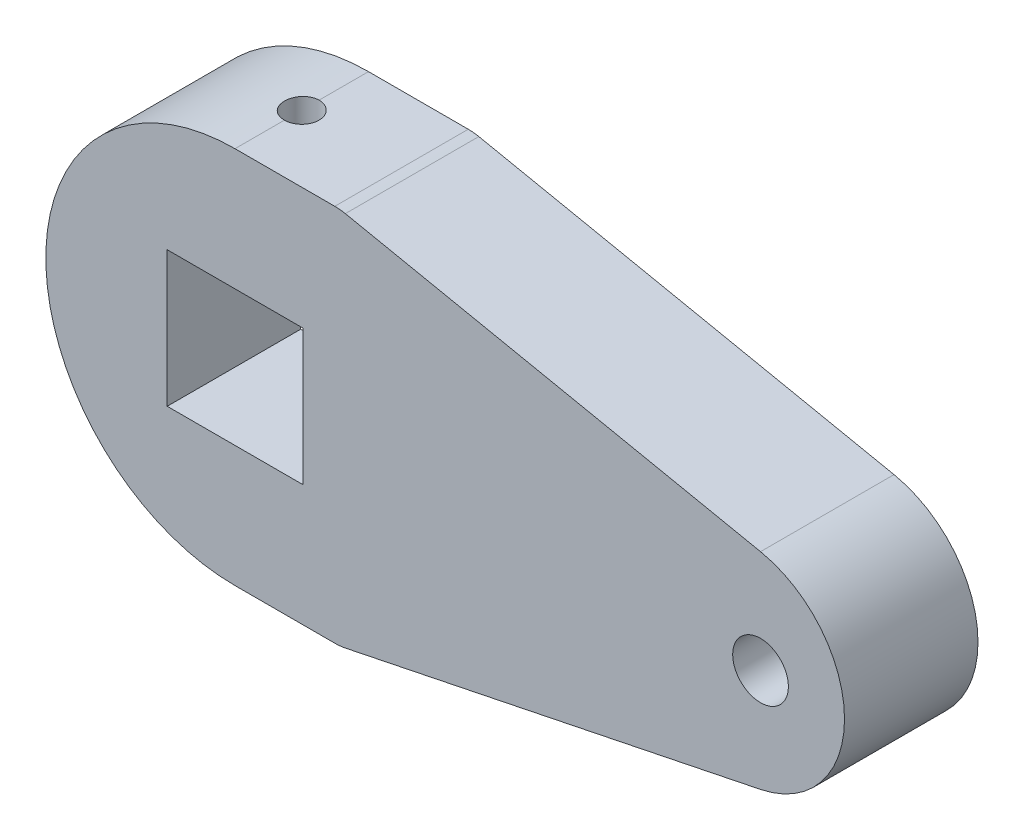
ISO-10303-21;
HEADER;
FILE_DESCRIPTION(('STEP AP214'),'2;1');
FILE_NAME('part.step','',(''),(''),'','','');
FILE_SCHEMA(('AUTOMOTIVE_DESIGN { 1 0 10303 214 1 1 1 1 }'));
ENDSEC;
DATA;
#1=APPLICATION_CONTEXT('core data for automotive mechanical design processes');
#2=APPLICATION_PROTOCOL_DEFINITION('international standard','automotive_design',2000,#1);
#3=PRODUCT_CONTEXT('',#1,'mechanical');
#4=PRODUCT('Part','Part','',(#3));
#5=PRODUCT_RELATED_PRODUCT_CATEGORY('part','',(#4));
#6=PRODUCT_DEFINITION_FORMATION('','',#4);
#7=PRODUCT_DEFINITION_CONTEXT('part definition',#1,'design');
#8=PRODUCT_DEFINITION('design','',#6,#7);
#9=PRODUCT_DEFINITION_SHAPE('','',#8);
#10=(LENGTH_UNIT() NAMED_UNIT(*) SI_UNIT(.MILLI.,.METRE.));
#11=(NAMED_UNIT(*) PLANE_ANGLE_UNIT() SI_UNIT($,.RADIAN.));
#12=(NAMED_UNIT(*) SI_UNIT($,.STERADIAN.) SOLID_ANGLE_UNIT());
#13=UNCERTAINTY_MEASURE_WITH_UNIT(LENGTH_MEASURE(1.E-05),#10,'distance_accuracy_value','');
#14=(GEOMETRIC_REPRESENTATION_CONTEXT(3) GLOBAL_UNCERTAINTY_ASSIGNED_CONTEXT((#13)) GLOBAL_UNIT_ASSIGNED_CONTEXT((#10,
#11,#12)) REPRESENTATION_CONTEXT('',''));
#15=CARTESIAN_POINT('',(0.,0.,0.));
#16=DIRECTION('',(0.,0.,1.));
#17=DIRECTION('',(1.,0.,0.));
#18=AXIS2_PLACEMENT_3D('',#15,#16,#17);
#19=CARTESIAN_POINT('',(0.,0.,12.7));
#20=DIRECTION('',(0.,0.,1.));
#21=DIRECTION('',(1.,0.,0.));
#22=AXIS2_PLACEMENT_3D('',#19,#20,#21);
#23=PLANE('',#22);
#24=CARTESIAN_POINT('',(50.,0.,12.7));
#25=DIRECTION('',(0.,0.,1.));
#26=DIRECTION('',(1.,0.,0.));
#27=AXIS2_PLACEMENT_3D('',#24,#25,#26);
#28=CIRCLE('',#27,2.65);
#29=CARTESIAN_POINT('',(52.65,0.,12.7));
#30=VERTEX_POINT('',#29);
#31=EDGE_CURVE('E152',#30,#30,#28,.T.);
#32=ORIENTED_EDGE('',*,*,#31,.F.);
#33=EDGE_LOOP('',(#32));
#34=FACE_BOUND('',#33,.T.);
#35=DIRECTION('',(1.,0.,0.));
#36=VECTOR('',#35,1.);
#37=CARTESIAN_POINT('',(10.,-18.,12.7));
#38=LINE('',#37,#36);
#39=CARTESIAN_POINT('',(0.,-18.,12.7));
#40=VERTEX_POINT('',#39);
#41=CARTESIAN_POINT('',(9.49253699801483,-18.,12.7));
#42=VERTEX_POINT('',#41);
#43=EDGE_CURVE('E209',#40,#42,#38,.T.);
#44=ORIENTED_EDGE('',*,*,#43,.T.);
#45=CARTESIAN_POINT('',(9.49253699801483,-13.,12.7));
#46=DIRECTION('',(0.,0.,1.));
#47=DIRECTION('',(1.,0.,0.));
#48=AXIS2_PLACEMENT_3D('',#45,#46,#47);
#49=CIRCLE('',#48,5.);
#50=CARTESIAN_POINT('',(10.4971150962142,-17.8980427565118,12.7));
#51=VERTEX_POINT('',#50);
#52=EDGE_CURVE('E187',#42,#51,#49,.T.);
#53=ORIENTED_EDGE('',*,*,#52,.T.);
#54=DIRECTION('',(0.979608551302367,0.200915619639883,0.));
#55=VECTOR('',#54,1.);
#56=CARTESIAN_POINT('',(10.,-18.,12.7));
#57=LINE('',#56,#55);
#58=CARTESIAN_POINT('',(50.,-9.79608551302372,12.7));
#59=VERTEX_POINT('',#58);
#60=EDGE_CURVE('E233',#51,#59,#57,.T.);
#61=ORIENTED_EDGE('',*,*,#60,.T.);
#62=CARTESIAN_POINT('',(47.9908438036012,0.,12.7));
#63=DIRECTION('',(0.,0.,1.));
#64=DIRECTION('',(-1.,0.,0.));
#65=AXIS2_PLACEMENT_3D('',#62,#63,#64);
#66=CIRCLE('',#65,10.);
#67=CARTESIAN_POINT('',(50.,9.79608551302372,12.7));
#68=VERTEX_POINT('',#67);
#69=EDGE_CURVE('E230',#59,#68,#66,.T.);
#70=ORIENTED_EDGE('',*,*,#69,.T.);
#71=DIRECTION('',(-0.979608551302367,0.200915619639883,0.));
#72=VECTOR('',#71,1.);
#73=CARTESIAN_POINT('',(50.,9.79608551302372,12.7));
#74=LINE('',#73,#72);
#75=CARTESIAN_POINT('',(10.4971150962142,17.8980427565118,12.7));
#76=VERTEX_POINT('',#75);
#77=EDGE_CURVE('E227',#68,#76,#74,.T.);
#78=ORIENTED_EDGE('',*,*,#77,.T.);
#79=CARTESIAN_POINT('',(9.49253699801483,13.,12.7));
#80=DIRECTION('',(0.,0.,1.));
#81=DIRECTION('',(1.,0.,0.));
#82=AXIS2_PLACEMENT_3D('',#79,#80,#81);
#83=CIRCLE('',#82,5.);
#84=CARTESIAN_POINT('',(9.49253699801483,18.,12.7));
#85=VERTEX_POINT('',#84);
#86=EDGE_CURVE('E54',#76,#85,#83,.T.);
#87=ORIENTED_EDGE('',*,*,#86,.T.);
#88=DIRECTION('',(-1.,0.,0.));
#89=VECTOR('',#88,1.);
#90=CARTESIAN_POINT('',(10.,18.,12.7));
#91=LINE('',#90,#89);
#92=CARTESIAN_POINT('',(0.,18.,12.7));
#93=VERTEX_POINT('',#92);
#94=EDGE_CURVE('E194',#85,#93,#91,.T.);
#95=ORIENTED_EDGE('',*,*,#94,.T.);
#96=CARTESIAN_POINT('',(0.,0.,12.7));
#97=DIRECTION('',(0.,0.,1.));
#98=DIRECTION('',(1.,0.,0.));
#99=AXIS2_PLACEMENT_3D('',#96,#97,#98);
#100=CIRCLE('',#99,18.);
#101=EDGE_CURVE('E156',#93,#40,#100,.T.);
#102=ORIENTED_EDGE('',*,*,#101,.T.);
#103=EDGE_LOOP('',(#44,#53,#61,#70,#78,#87,#95,#102));
#104=FACE_BOUND('',#103,.T.);
#105=DIRECTION('',(1.,0.,0.));
#106=VECTOR('',#105,1.);
#107=CARTESIAN_POINT('',(-6.45,-6.45,12.7));
#108=LINE('',#107,#106);
#109=CARTESIAN_POINT('',(-6.45,-6.45,12.7));
#110=VERTEX_POINT('',#109);
#111=CARTESIAN_POINT('',(6.45,-6.45,12.7));
#112=VERTEX_POINT('',#111);
#113=EDGE_CURVE('E275',#110,#112,#108,.T.);
#114=ORIENTED_EDGE('',*,*,#113,.F.);
#115=DIRECTION('',(0.,-1.,0.));
#116=VECTOR('',#115,1.);
#117=CARTESIAN_POINT('',(-6.45,6.45,12.7));
#118=LINE('',#117,#116);
#119=CARTESIAN_POINT('',(-6.45,6.45,12.7));
#120=VERTEX_POINT('',#119);
#121=EDGE_CURVE('E257',#120,#110,#118,.T.);
#122=ORIENTED_EDGE('',*,*,#121,.F.);
#123=DIRECTION('',(-1.,0.,0.));
#124=VECTOR('',#123,1.);
#125=CARTESIAN_POINT('',(-6.45,6.45,12.7));
#126=LINE('',#125,#124);
#127=CARTESIAN_POINT('',(6.45,6.45,12.7));
#128=VERTEX_POINT('',#127);
#129=EDGE_CURVE('E252',#128,#120,#126,.T.);
#130=ORIENTED_EDGE('',*,*,#129,.F.);
#131=DIRECTION('',(0.,1.,0.));
#132=VECTOR('',#131,1.);
#133=CARTESIAN_POINT('',(6.45,6.45,12.7));
#134=LINE('',#133,#132);
#135=EDGE_CURVE('E271',#112,#128,#134,.T.);
#136=ORIENTED_EDGE('',*,*,#135,.F.);
#137=EDGE_LOOP('',(#114,#122,#130,#136));
#138=FACE_BOUND('',#137,.T.);
#139=ADVANCED_FACE('F38',(#34,#104,#138),#23,.T.);
#140=CARTESIAN_POINT('',(0.,0.,0.));
#141=DIRECTION('',(0.,0.,1.));
#142=DIRECTION('',(1.,0.,0.));
#143=AXIS2_PLACEMENT_3D('',#140,#141,#142);
#144=PLANE('',#143);
#145=CARTESIAN_POINT('',(50.,0.,0.));
#146=DIRECTION('',(0.,0.,-1.));
#147=DIRECTION('',(-1.,0.,0.));
#148=AXIS2_PLACEMENT_3D('',#145,#146,#147);
#149=CIRCLE('',#148,2.65);
#150=CARTESIAN_POINT('',(47.35,0.,0.));
#151=VERTEX_POINT('',#150);
#152=EDGE_CURVE('E324',#151,#151,#149,.T.);
#153=ORIENTED_EDGE('',*,*,#152,.F.);
#154=EDGE_LOOP('',(#153));
#155=FACE_BOUND('',#154,.T.);
#156=DIRECTION('',(0.979608551302367,0.200915619639883,0.));
#157=VECTOR('',#156,1.);
#158=CARTESIAN_POINT('',(10.,-18.,0.));
#159=LINE('',#158,#157);
#160=CARTESIAN_POINT('',(10.4971150962142,-17.8980427565118,0.));
#161=VERTEX_POINT('',#160);
#162=CARTESIAN_POINT('',(50.,-9.79608551302372,0.));
#163=VERTEX_POINT('',#162);
#164=EDGE_CURVE('E215',#161,#163,#159,.T.);
#165=ORIENTED_EDGE('',*,*,#164,.F.);
#166=CARTESIAN_POINT('',(9.49253699801483,-13.,0.));
#167=DIRECTION('',(0.,0.,1.));
#168=DIRECTION('',(1.,0.,0.));
#169=AXIS2_PLACEMENT_3D('',#166,#167,#168);
#170=CIRCLE('',#169,5.);
#171=CARTESIAN_POINT('',(9.49253699801483,-18.,0.));
#172=VERTEX_POINT('',#171);
#173=EDGE_CURVE('E179',#161,#172,#170,.F.);
#174=ORIENTED_EDGE('',*,*,#173,.T.);
#175=DIRECTION('',(1.,0.,0.));
#176=VECTOR('',#175,1.);
#177=CARTESIAN_POINT('',(10.,-18.,0.));
#178=LINE('',#177,#176);
#179=CARTESIAN_POINT('',(0.,-18.,0.));
#180=VERTEX_POINT('',#179);
#181=EDGE_CURVE('E218',#180,#172,#178,.T.);
#182=ORIENTED_EDGE('',*,*,#181,.F.);
#183=CARTESIAN_POINT('',(0.,0.,0.));
#184=DIRECTION('',(0.,0.,1.));
#185=DIRECTION('',(1.,0.,0.));
#186=AXIS2_PLACEMENT_3D('',#183,#184,#185);
#187=CIRCLE('',#186,18.);
#188=CARTESIAN_POINT('',(0.,18.,0.));
#189=VERTEX_POINT('',#188);
#190=EDGE_CURVE('E203',#189,#180,#187,.T.);
#191=ORIENTED_EDGE('',*,*,#190,.F.);
#192=DIRECTION('',(-1.,0.,0.));
#193=VECTOR('',#192,1.);
#194=CARTESIAN_POINT('',(10.,18.,0.));
#195=LINE('',#194,#193);
#196=CARTESIAN_POINT('',(9.49253699801483,18.,0.));
#197=VERTEX_POINT('',#196);
#198=EDGE_CURVE('E193',#197,#189,#195,.T.);
#199=ORIENTED_EDGE('',*,*,#198,.F.);
#200=CARTESIAN_POINT('',(9.49253699801483,13.,0.));
#201=DIRECTION('',(0.,0.,1.));
#202=DIRECTION('',(1.,0.,0.));
#203=AXIS2_PLACEMENT_3D('',#200,#201,#202);
#204=CIRCLE('',#203,5.);
#205=CARTESIAN_POINT('',(10.4971150962142,17.8980427565118,0.));
#206=VERTEX_POINT('',#205);
#207=EDGE_CURVE('E176',#197,#206,#204,.F.);
#208=ORIENTED_EDGE('',*,*,#207,.T.);
#209=DIRECTION('',(-0.979608551302367,0.200915619639883,0.));
#210=VECTOR('',#209,1.);
#211=CARTESIAN_POINT('',(50.,9.79608551302372,0.));
#212=LINE('',#211,#210);
#213=CARTESIAN_POINT('',(50.,9.79608551302372,0.));
#214=VERTEX_POINT('',#213);
#215=EDGE_CURVE('E205',#214,#206,#212,.T.);
#216=ORIENTED_EDGE('',*,*,#215,.F.);
#217=CARTESIAN_POINT('',(47.9908438036012,0.,0.));
#218=DIRECTION('',(0.,0.,1.));
#219=DIRECTION('',(-1.,0.,0.));
#220=AXIS2_PLACEMENT_3D('',#217,#218,#219);
#221=CIRCLE('',#220,10.);
#222=EDGE_CURVE('E210',#163,#214,#221,.T.);
#223=ORIENTED_EDGE('',*,*,#222,.F.);
#224=EDGE_LOOP('',(#165,#174,#182,#191,#199,#208,#216,#223));
#225=FACE_BOUND('',#224,.T.);
#226=DIRECTION('',(0.,-1.,0.));
#227=VECTOR('',#226,1.);
#228=CARTESIAN_POINT('',(-6.45,6.45,0.));
#229=LINE('',#228,#227);
#230=CARTESIAN_POINT('',(-6.45,6.45,0.));
#231=VERTEX_POINT('',#230);
#232=CARTESIAN_POINT('',(-6.45,-6.45,0.));
#233=VERTEX_POINT('',#232);
#234=EDGE_CURVE('E142',#231,#233,#229,.T.);
#235=ORIENTED_EDGE('',*,*,#234,.T.);
#236=DIRECTION('',(1.,0.,0.));
#237=VECTOR('',#236,1.);
#238=CARTESIAN_POINT('',(-6.45,-6.45,0.));
#239=LINE('',#238,#237);
#240=CARTESIAN_POINT('',(6.45,-6.45,0.));
#241=VERTEX_POINT('',#240);
#242=EDGE_CURVE('E262',#233,#241,#239,.T.);
#243=ORIENTED_EDGE('',*,*,#242,.T.);
#244=DIRECTION('',(0.,1.,0.));
#245=VECTOR('',#244,1.);
#246=CARTESIAN_POINT('',(6.45,6.45,0.));
#247=LINE('',#246,#245);
#248=CARTESIAN_POINT('',(6.45,6.45,0.));
#249=VERTEX_POINT('',#248);
#250=EDGE_CURVE('E258',#241,#249,#247,.T.);
#251=ORIENTED_EDGE('',*,*,#250,.T.);
#252=DIRECTION('',(-1.,0.,0.));
#253=VECTOR('',#252,1.);
#254=CARTESIAN_POINT('',(-6.45,6.45,0.));
#255=LINE('',#254,#253);
#256=EDGE_CURVE('E253',#249,#231,#255,.T.);
#257=ORIENTED_EDGE('',*,*,#256,.T.);
#258=EDGE_LOOP('',(#235,#243,#251,#257));
#259=FACE_BOUND('',#258,.T.);
#260=ADVANCED_FACE('F199',(#155,#225,#259),#144,.F.);
#261=CARTESIAN_POINT('',(10.,-18.,12.7));
#262=DIRECTION('',(0.,1.,0.));
#263=DIRECTION('',(0.,0.,1.));
#264=AXIS2_PLACEMENT_3D('',#261,#262,#263);
#265=PLANE('',#264);
#266=ORIENTED_EDGE('',*,*,#181,.T.);
#267=DIRECTION('',(0.,0.,-1.));
#268=VECTOR('',#267,1.);
#269=CARTESIAN_POINT('',(9.49253699801483,-18.,12.7));
#270=LINE('',#269,#268);
#271=EDGE_CURVE('E182',#172,#42,#270,.F.);
#272=ORIENTED_EDGE('',*,*,#271,.T.);
#273=ORIENTED_EDGE('',*,*,#43,.F.);
#274=DIRECTION('',(0.,0.,-1.));
#275=VECTOR('',#274,1.);
#276=CARTESIAN_POINT('',(0.,-18.,12.7));
#277=LINE('',#276,#275);
#278=EDGE_CURVE('E165',#40,#180,#277,.T.);
#279=ORIENTED_EDGE('',*,*,#278,.T.);
#280=EDGE_LOOP('',(#266,#272,#273,#279));
#281=FACE_BOUND('',#280,.T.);
#282=ADVANCED_FACE('F314',(#281),#265,.F.);
#283=CARTESIAN_POINT('',(10.,-18.,12.7));
#284=DIRECTION('',(-0.200915619639883,0.979608551302367,0.));
#285=DIRECTION('',(-0.979608551302367,-0.200915619639883,0.));
#286=AXIS2_PLACEMENT_3D('',#283,#284,#285);
#287=PLANE('',#286);
#288=ORIENTED_EDGE('',*,*,#60,.F.);
#289=DIRECTION('',(0.,0.,-1.));
#290=VECTOR('',#289,1.);
#291=CARTESIAN_POINT('',(10.4971150962142,-17.8980427565118,12.7));
#292=LINE('',#291,#290);
#293=EDGE_CURVE('E172',#51,#161,#292,.T.);
#294=ORIENTED_EDGE('',*,*,#293,.T.);
#295=ORIENTED_EDGE('',*,*,#164,.T.);
#296=DIRECTION('',(0.,0.,-1.));
#297=VECTOR('',#296,1.);
#298=CARTESIAN_POINT('',(50.,-9.79608551302372,12.7));
#299=LINE('',#298,#297);
#300=EDGE_CURVE('E163',#59,#163,#299,.T.);
#301=ORIENTED_EDGE('',*,*,#300,.F.);
#302=EDGE_LOOP('',(#288,#294,#295,#301));
#303=FACE_BOUND('',#302,.T.);
#304=ADVANCED_FACE('F319',(#303),#287,.F.);
#305=CARTESIAN_POINT('',(47.9908438036012,0.,12.7));
#306=DIRECTION('',(0.,0.,-1.));
#307=DIRECTION('',(-1.,0.,0.));
#308=AXIS2_PLACEMENT_3D('',#305,#306,#307);
#309=CYLINDRICAL_SURFACE('',#308,10.);
#310=ORIENTED_EDGE('',*,*,#222,.T.);
#311=DIRECTION('',(0.,0.,-1.));
#312=VECTOR('',#311,1.);
#313=CARTESIAN_POINT('',(50.,9.79608551302372,12.7));
#314=LINE('',#313,#312);
#315=EDGE_CURVE('E158',#68,#214,#314,.T.);
#316=ORIENTED_EDGE('',*,*,#315,.F.);
#317=ORIENTED_EDGE('',*,*,#69,.F.);
#318=ORIENTED_EDGE('',*,*,#300,.T.);
#319=EDGE_LOOP('',(#310,#316,#317,#318));
#320=FACE_BOUND('',#319,.T.);
#321=ADVANCED_FACE('F357',(#320),#309,.T.);
#322=CARTESIAN_POINT('',(50.,9.79608551302372,12.7));
#323=DIRECTION('',(-0.200915619639883,-0.979608551302367,0.));
#324=DIRECTION('',(0.979608551302367,-0.200915619639883,0.));
#325=AXIS2_PLACEMENT_3D('',#322,#323,#324);
#326=PLANE('',#325);
#327=ORIENTED_EDGE('',*,*,#215,.T.);
#328=DIRECTION('',(0.,0.,-1.));
#329=VECTOR('',#328,1.);
#330=CARTESIAN_POINT('',(10.4971150962142,17.8980427565118,12.7));
#331=LINE('',#330,#329);
#332=EDGE_CURVE('E11',#206,#76,#331,.F.);
#333=ORIENTED_EDGE('',*,*,#332,.T.);
#334=ORIENTED_EDGE('',*,*,#77,.F.);
#335=ORIENTED_EDGE('',*,*,#315,.T.);
#336=EDGE_LOOP('',(#327,#333,#334,#335));
#337=FACE_BOUND('',#336,.T.);
#338=ADVANCED_FACE('F359',(#337),#326,.F.);
#339=CARTESIAN_POINT('',(10.,18.,12.7));
#340=DIRECTION('',(0.,-1.,0.));
#341=DIRECTION('',(0.,0.,-1.));
#342=AXIS2_PLACEMENT_3D('',#339,#340,#341);
#343=PLANE('',#342);
#344=ORIENTED_EDGE('',*,*,#94,.F.);
#345=DIRECTION('',(0.,0.,-1.));
#346=VECTOR('',#345,1.);
#347=CARTESIAN_POINT('',(9.49253699801483,18.,12.7));
#348=LINE('',#347,#346);
#349=EDGE_CURVE('E47',#85,#197,#348,.T.);
#350=ORIENTED_EDGE('',*,*,#349,.T.);
#351=ORIENTED_EDGE('',*,*,#198,.T.);
#352=DIRECTION('',(0.,0.,-1.));
#353=VECTOR('',#352,1.);
#354=CARTESIAN_POINT('',(0.,18.,12.7));
#355=LINE('',#354,#353);
#356=CARTESIAN_POINT('',(0.,18.,4.7));
#357=VERTEX_POINT('',#356);
#358=EDGE_CURVE('E150',#357,#189,#355,.T.);
#359=ORIENTED_EDGE('',*,*,#358,.F.);
#360=CARTESIAN_POINT('',(0.,18.,6.35));
#361=DIRECTION('',(0.,1.,0.));
#362=DIRECTION('',(0.,0.,1.));
#363=AXIS2_PLACEMENT_3D('',#360,#361,#362);
#364=CIRCLE('',#363,1.65);
#365=CARTESIAN_POINT('',(0.,18.,8.));
#366=VERTEX_POINT('',#365);
#367=EDGE_CURVE('E136',#366,#357,#364,.T.);
#368=ORIENTED_EDGE('',*,*,#367,.F.);
#369=EDGE_CURVE('E148',#93,#366,#355,.T.);
#370=ORIENTED_EDGE('',*,*,#369,.F.);
#371=EDGE_LOOP('',(#344,#350,#351,#359,#368,#370));
#372=FACE_BOUND('',#371,.T.);
#373=ADVANCED_FACE('F147',(#372),#343,.F.);
#374=CARTESIAN_POINT('',(0.,0.,12.7));
#375=DIRECTION('',(0.,0.,-1.));
#376=DIRECTION('',(-1.,0.,0.));
#377=AXIS2_PLACEMENT_3D('',#374,#375,#376);
#378=CYLINDRICAL_SURFACE('',#377,18.);
#379=ORIENTED_EDGE('',*,*,#369,.T.);
#380=CARTESIAN_POINT('',(0.,18.,8.));
#381=CARTESIAN_POINT('',(-0.0463178829656638,18.0000009989344,7.99999980684443));
#382=CARTESIAN_POINT('',(-0.0926134820377733,17.9998209944453,7.99804845906153));
#383=CARTESIAN_POINT('',(-0.184871526276593,17.9991095739873,7.99026449287788));
#384=CARTESIAN_POINT('',(-0.230833992326174,17.9985781802416,7.98443211992899));
#385=CARTESIAN_POINT('',(-0.367636386306787,17.9964752503602,7.96117206870355));
#386=CARTESIAN_POINT('',(-0.457556947001784,17.9943948922111,7.93798128551978));
#387=CARTESIAN_POINT('',(-0.632204676976391,17.9891071555683,7.87688943632508));
#388=CARTESIAN_POINT('',(-0.716929797524095,17.9858993357937,7.83898260994516));
#389=CARTESIAN_POINT('',(-0.878816659571651,17.9787165148884,7.74954525838475));
#390=CARTESIAN_POINT('',(-0.955979406902709,17.9747416159921,7.69801654835882));
#391=CARTESIAN_POINT('',(-1.10077288933926,17.9664571688322,7.58263648137789));
#392=CARTESIAN_POINT('',(-1.16837814053119,17.9621467716926,7.51875321661845));
#393=CARTESIAN_POINT('',(-1.29193162390202,17.9536836637368,7.38053663764546));
#394=CARTESIAN_POINT('',(-1.34787807540185,17.9495309770873,7.30620173002437));
#395=CARTESIAN_POINT('',(-1.44660529148647,17.9418449056152,7.14903692554394));
#396=CARTESIAN_POINT('',(-1.48936284601674,17.93831261723,7.06619239086436));
#397=CARTESIAN_POINT('',(-1.56034827499687,17.932277872646,6.8944669915571));
#398=CARTESIAN_POINT('',(-1.58857733395379,17.9297753324951,6.80558661969978));
#399=CARTESIAN_POINT('',(-1.6296313628738,17.9260907532874,6.62457285048331));
#400=CARTESIAN_POINT('',(-1.64249940635308,17.9249050224465,6.53244929862342));
#401=CARTESIAN_POINT('',(-1.65259931472223,17.9239767513846,6.34734062981205));
#402=CARTESIAN_POINT('',(-1.64983114607363,17.9242342142592,6.254355511013));
#403=CARTESIAN_POINT('',(-1.62877220458844,17.9261599270525,6.07046433663181));
#404=CARTESIAN_POINT('',(-1.61052880261772,17.9278238715691,5.97955280478689));
#405=CARTESIAN_POINT('',(-1.55911097456794,17.932368315503,5.8020879610971));
#406=CARTESIAN_POINT('',(-1.52593644875911,17.9352488230462,5.71553467836667));
#407=CARTESIAN_POINT('',(-1.44554467933978,17.9419068597054,5.54909083178953));
#408=CARTESIAN_POINT('',(-1.39830601216547,17.9456857555323,5.46921067239837));
#409=CARTESIAN_POINT('',(-1.29114442474307,17.9537133530943,5.31849846389572));
#410=CARTESIAN_POINT('',(-1.23122176729735,17.9579620450948,5.24766622736709));
#411=CARTESIAN_POINT('',(-1.10013770256852,17.9664692379501,5.11679033797733));
#412=CARTESIAN_POINT('',(-1.02893693927735,17.9707277196784,5.05678610037191));
#413=CARTESIAN_POINT('',(-0.877424416598308,17.9787616560238,4.94955720656498));
#414=CARTESIAN_POINT('',(-0.797109879608334,17.9825369626336,4.90233646131024));
#415=CARTESIAN_POINT('',(-0.629612790455696,17.9891805724855,4.82201866124521));
#416=CARTESIAN_POINT('',(-0.5424252530297,17.9920482096551,4.78893197219306));
#417=CARTESIAN_POINT('',(-0.363765659435788,17.9965446794729,4.73792792745496));
#418=CARTESIAN_POINT('',(-0.272300314387989,17.9981753877253,4.71998760005501));
#419=CARTESIAN_POINT('',(-0.150166554787424,17.9993988265539,4.70657008123187));
#420=CARTESIAN_POINT('',(-0.120160027770201,17.9996241327804,4.70410506352839));
#421=CARTESIAN_POINT('',(-0.060106485086979,17.9999245310706,4.70082225197847));
#422=CARTESIAN_POINT('',(-0.0300596207964771,17.9999998734425,4.7000017132781));
#423=CARTESIAN_POINT('',(0.,18.,4.7));
#424=B_SPLINE_CURVE_WITH_KNOTS('',3,(#380,#381,#382,#383,#384,#385,#386,#387,#388,#389,#390,
#391,#392,#393,#394,#395,#396,#397,#398,#399,#400,#401,#402,#403,#404,#405,#406,#407,#408,#409,
#410,#411,#412,#413,#414,#415,#416,#417,#418,#419,#420,#421,#422,#423),.UNSPECIFIED.,.F.,.F.,(4,
2,2,2,2,2,2,2,2,2,2,2,2,2,2,2,2,2,2,2,2,4),(0.,0.138867999720171,0.277727217696258,
0.554955088022956,0.832291584534346,1.10959114378429,1.38761667992133,1.66568464855659,
1.94423921046481,2.22277105824301,2.50052003191979,2.77826960134673,3.05517201363512,
3.33207627547135,3.60940451592082,3.88672701090823,4.16503947997953,4.44343699923102,
4.72203834302456,5.00021638341156,5.09050929335806,5.18065136650361),.UNSPECIFIED.);
#425=EDGE_CURVE('E133',#366,#357,#424,.T.);
#426=ORIENTED_EDGE('',*,*,#425,.T.);
#427=ORIENTED_EDGE('',*,*,#358,.T.);
#428=ORIENTED_EDGE('',*,*,#190,.T.);
#429=ORIENTED_EDGE('',*,*,#278,.F.);
#430=ORIENTED_EDGE('',*,*,#101,.F.);
#431=EDGE_LOOP('',(#379,#426,#427,#428,#429,#430));
#432=FACE_BOUND('',#431,.T.);
#433=ADVANCED_FACE('F154',(#432),#378,.T.);
#434=CARTESIAN_POINT('',(-6.45,6.45,12.7));
#435=DIRECTION('',(1.,0.,0.));
#436=DIRECTION('',(0.,0.,-1.));
#437=AXIS2_PLACEMENT_3D('',#434,#435,#436);
#438=PLANE('',#437);
#439=ORIENTED_EDGE('',*,*,#234,.F.);
#440=DIRECTION('',(0.,0.,-1.));
#441=VECTOR('',#440,1.);
#442=CARTESIAN_POINT('',(-6.45,6.45,12.7));
#443=LINE('',#442,#441);
#444=EDGE_CURVE('E248',#120,#231,#443,.T.);
#445=ORIENTED_EDGE('',*,*,#444,.F.);
#446=ORIENTED_EDGE('',*,*,#121,.T.);
#447=DIRECTION('',(0.,0.,-1.));
#448=VECTOR('',#447,1.);
#449=CARTESIAN_POINT('',(-6.45,-6.45,12.7));
#450=LINE('',#449,#448);
#451=EDGE_CURVE('E222',#110,#233,#450,.T.);
#452=ORIENTED_EDGE('',*,*,#451,.T.);
#453=EDGE_LOOP('',(#439,#445,#446,#452));
#454=FACE_BOUND('',#453,.T.);
#455=ADVANCED_FACE('F306',(#454),#438,.T.);
#456=CARTESIAN_POINT('',(-6.45,-6.45,12.7));
#457=DIRECTION('',(0.,1.,0.));
#458=DIRECTION('',(-1.,0.,0.));
#459=AXIS2_PLACEMENT_3D('',#456,#457,#458);
#460=PLANE('',#459);
#461=ORIENTED_EDGE('',*,*,#242,.F.);
#462=ORIENTED_EDGE('',*,*,#451,.F.);
#463=ORIENTED_EDGE('',*,*,#113,.T.);
#464=DIRECTION('',(0.,0.,-1.));
#465=VECTOR('',#464,1.);
#466=CARTESIAN_POINT('',(6.45,-6.45,12.7));
#467=LINE('',#466,#465);
#468=EDGE_CURVE('E242',#112,#241,#467,.T.);
#469=ORIENTED_EDGE('',*,*,#468,.T.);
#470=EDGE_LOOP('',(#461,#462,#463,#469));
#471=FACE_BOUND('',#470,.T.);
#472=ADVANCED_FACE('F302',(#471),#460,.T.);
#473=CARTESIAN_POINT('',(6.45,6.45,12.7));
#474=DIRECTION('',(-1.,0.,0.));
#475=DIRECTION('',(0.,-1.,0.));
#476=AXIS2_PLACEMENT_3D('',#473,#474,#475);
#477=PLANE('',#476);
#478=ORIENTED_EDGE('',*,*,#250,.F.);
#479=ORIENTED_EDGE('',*,*,#468,.F.);
#480=ORIENTED_EDGE('',*,*,#135,.T.);
#481=DIRECTION('',(0.,0.,-1.));
#482=VECTOR('',#481,1.);
#483=CARTESIAN_POINT('',(6.45,6.45,12.7));
#484=LINE('',#483,#482);
#485=EDGE_CURVE('E245',#128,#249,#484,.T.);
#486=ORIENTED_EDGE('',*,*,#485,.T.);
#487=EDGE_LOOP('',(#478,#479,#480,#486));
#488=FACE_BOUND('',#487,.T.);
#489=ADVANCED_FACE('F298',(#488),#477,.T.);
#490=CARTESIAN_POINT('',(-6.45,6.45,12.7));
#491=DIRECTION('',(0.,-1.,0.));
#492=DIRECTION('',(0.,0.,-1.));
#493=AXIS2_PLACEMENT_3D('',#490,#491,#492);
#494=PLANE('',#493);
#495=CARTESIAN_POINT('',(0.,6.45,6.35));
#496=DIRECTION('',(0.,-1.,0.));
#497=DIRECTION('',(0.,0.,-1.));
#498=AXIS2_PLACEMENT_3D('',#495,#496,#497);
#499=CIRCLE('',#498,1.65);
#500=CARTESIAN_POINT('',(0.,6.45,4.7));
#501=VERTEX_POINT('',#500);
#502=EDGE_CURVE('E143',#501,#501,#499,.T.);
#503=ORIENTED_EDGE('',*,*,#502,.F.);
#504=EDGE_LOOP('',(#503));
#505=FACE_BOUND('',#504,.T.);
#506=ORIENTED_EDGE('',*,*,#256,.F.);
#507=ORIENTED_EDGE('',*,*,#485,.F.);
#508=ORIENTED_EDGE('',*,*,#129,.T.);
#509=ORIENTED_EDGE('',*,*,#444,.T.);
#510=EDGE_LOOP('',(#506,#507,#508,#509));
#511=FACE_BOUND('',#510,.T.);
#512=ADVANCED_FACE('F294',(#505,#511),#494,.T.);
#513=CARTESIAN_POINT('',(0.,18.,6.35));
#514=DIRECTION('',(0.,1.,0.));
#515=DIRECTION('',(0.,0.,1.));
#516=AXIS2_PLACEMENT_3D('',#513,#514,#515);
#517=CYLINDRICAL_SURFACE('',#516,1.65);
#518=ORIENTED_EDGE('',*,*,#502,.T.);
#519=EDGE_LOOP('',(#518));
#520=FACE_BOUND('',#519,.T.);
#521=ORIENTED_EDGE('',*,*,#367,.T.);
#522=ORIENTED_EDGE('',*,*,#425,.F.);
#523=EDGE_LOOP('',(#521,#522));
#524=FACE_BOUND('',#523,.T.);
#525=ADVANCED_FACE('F135',(#520,#524),#517,.F.);
#526=CARTESIAN_POINT('',(50.,0.,0.));
#527=DIRECTION('',(0.,0.,-1.));
#528=DIRECTION('',(-1.,0.,0.));
#529=AXIS2_PLACEMENT_3D('',#526,#527,#528);
#530=CYLINDRICAL_SURFACE('',#529,2.65);
#531=ORIENTED_EDGE('',*,*,#152,.T.);
#532=EDGE_LOOP('',(#531));
#533=FACE_BOUND('',#532,.T.);
#534=ORIENTED_EDGE('',*,*,#31,.T.);
#535=EDGE_LOOP('',(#534));
#536=FACE_BOUND('',#535,.T.);
#537=ADVANCED_FACE('F293',(#533,#536),#530,.F.);
#538=CARTESIAN_POINT('',(9.49253699801483,-13.,12.7));
#539=DIRECTION('',(0.,0.,-1.));
#540=DIRECTION('',(-1.,0.,0.));
#541=AXIS2_PLACEMENT_3D('',#538,#539,#540);
#542=CYLINDRICAL_SURFACE('',#541,5.);
#543=ORIENTED_EDGE('',*,*,#52,.F.);
#544=ORIENTED_EDGE('',*,*,#271,.F.);
#545=ORIENTED_EDGE('',*,*,#173,.F.);
#546=ORIENTED_EDGE('',*,*,#293,.F.);
#547=EDGE_LOOP('',(#543,#544,#545,#546));
#548=FACE_BOUND('',#547,.T.);
#549=ADVANCED_FACE('F351',(#548),#542,.T.);
#550=CARTESIAN_POINT('',(9.49253699801483,13.,12.7));
#551=DIRECTION('',(0.,0.,-1.));
#552=DIRECTION('',(-1.,0.,0.));
#553=AXIS2_PLACEMENT_3D('',#550,#551,#552);
#554=CYLINDRICAL_SURFACE('',#553,5.);
#555=ORIENTED_EDGE('',*,*,#86,.F.);
#556=ORIENTED_EDGE('',*,*,#332,.F.);
#557=ORIENTED_EDGE('',*,*,#207,.F.);
#558=ORIENTED_EDGE('',*,*,#349,.F.);
#559=EDGE_LOOP('',(#555,#556,#557,#558));
#560=FACE_BOUND('',#559,.T.);
#561=ADVANCED_FACE('F40',(#560),#554,.T.);
#562=CLOSED_SHELL('',(#139,#260,#282,#304,#321,#338,#373,#433,#455,#472,#489,#512,#525,#537,
#549,#561));
#563=MANIFOLD_SOLID_BREP('B2',#562);
#564=ADVANCED_BREP_SHAPE_REPRESENTATION('',(#18,#563),#14);
#565=SHAPE_DEFINITION_REPRESENTATION(#9,#564);
ENDSEC;
END-ISO-10303-21;
